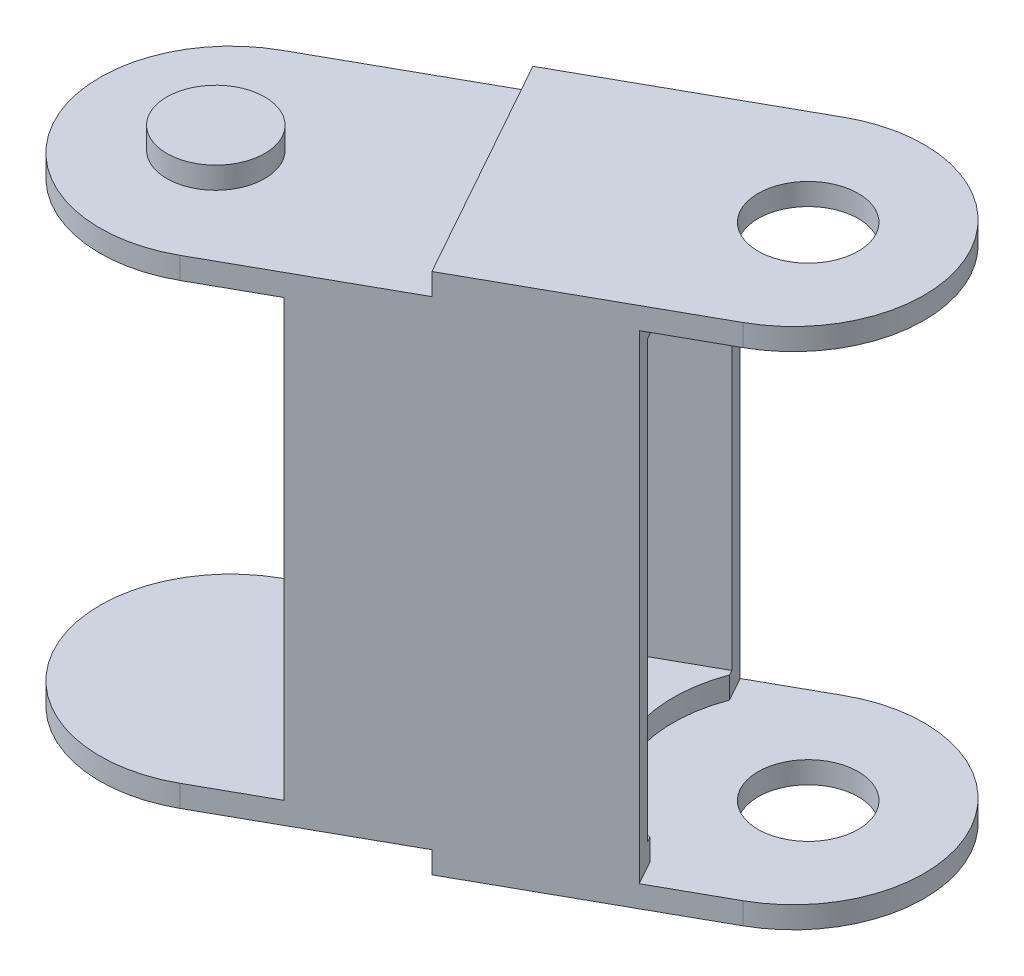
ISO-10303-21;
HEADER;
FILE_DESCRIPTION(('STEP AP214'),'2;1');
FILE_NAME('part.step','',(''),(''),'','','');
FILE_SCHEMA(('AUTOMOTIVE_DESIGN { 1 0 10303 214 1 1 1 1 }'));
ENDSEC;
DATA;
#1=APPLICATION_CONTEXT('core data for automotive mechanical design processes');
#2=APPLICATION_PROTOCOL_DEFINITION('international standard','automotive_design',2000,#1);
#3=PRODUCT_CONTEXT('',#1,'mechanical');
#4=PRODUCT('Part','Part','',(#3));
#5=PRODUCT_RELATED_PRODUCT_CATEGORY('part','',(#4));
#6=PRODUCT_DEFINITION_FORMATION('','',#4);
#7=PRODUCT_DEFINITION_CONTEXT('part definition',#1,'design');
#8=PRODUCT_DEFINITION('design','',#6,#7);
#9=PRODUCT_DEFINITION_SHAPE('','',#8);
#10=(LENGTH_UNIT() NAMED_UNIT(*) SI_UNIT(.MILLI.,.METRE.));
#11=(NAMED_UNIT(*) PLANE_ANGLE_UNIT() SI_UNIT($,.RADIAN.));
#12=(NAMED_UNIT(*) SI_UNIT($,.STERADIAN.) SOLID_ANGLE_UNIT());
#13=UNCERTAINTY_MEASURE_WITH_UNIT(LENGTH_MEASURE(1.E-05),#10,'distance_accuracy_value','');
#14=(GEOMETRIC_REPRESENTATION_CONTEXT(3) GLOBAL_UNCERTAINTY_ASSIGNED_CONTEXT((#13)) GLOBAL_UNIT_ASSIGNED_CONTEXT((#10,
#11,#12)) REPRESENTATION_CONTEXT('',''));
#15=CARTESIAN_POINT('',(0.,0.,0.));
#16=DIRECTION('',(0.,0.,1.));
#17=DIRECTION('',(1.,0.,0.));
#18=AXIS2_PLACEMENT_3D('',#15,#16,#17);
#19=CARTESIAN_POINT('',(-557.4671148621,21.5,9.7416578874));
#20=DIRECTION('',(0.,1.,0.));
#21=DIRECTION('',(-0.873355743090078,0.,0.487082894394351));
#22=AXIS2_PLACEMENT_3D('',#19,#20,#21);
#23=CYLINDRICAL_SURFACE('',#22,2.25);
#24=CARTESIAN_POINT('',(-557.4671148621,21.,9.7416578874));
#25=DIRECTION('',(0.,1.,0.));
#26=DIRECTION('',(-0.873355743090083,0.,0.487082894394342));
#27=AXIS2_PLACEMENT_3D('',#24,#25,#26);
#28=CIRCLE('',#27,2.25);
#29=CARTESIAN_POINT('',(-559.432165284053,21.,10.8375943997873));
#30=VERTEX_POINT('',#29);
#31=EDGE_CURVE('E205',#30,#30,#28,.F.);
#32=ORIENTED_EDGE('',*,*,#31,.F.);
#33=EDGE_LOOP('',(#32));
#34=FACE_BOUND('',#33,.T.);
#35=CARTESIAN_POINT('',(-557.4671148621,22.,9.7416578874));
#36=DIRECTION('',(0.,-1.,0.));
#37=DIRECTION('',(0.873355743090046,0.,-0.487082894394407));
#38=AXIS2_PLACEMENT_3D('',#35,#36,#37);
#39=CIRCLE('',#38,2.25);
#40=CARTESIAN_POINT('',(-555.502064440147,22.,8.64572137501259));
#41=VERTEX_POINT('',#40);
#42=EDGE_CURVE('E202',#41,#41,#39,.F.);
#43=ORIENTED_EDGE('',*,*,#42,.F.);
#44=EDGE_LOOP('',(#43));
#45=FACE_BOUND('',#44,.T.);
#46=ADVANCED_FACE('F17',(#34,#45),#23,.T.);
#47=CARTESIAN_POINT('',(-546.684415807773,21.,10.59804629639));
#48=DIRECTION('',(0.,1.,0.));
#49=DIRECTION('',(-0.487082894394448,0.,-0.873355743090023));
#50=AXIS2_PLACEMENT_3D('',#47,#48,#49);
#51=PLANE('',#50);
#52=CARTESIAN_POINT('',(-557.030436990516,21.,9.498116440067));
#53=DIRECTION('',(0.,1.,0.));
#54=DIRECTION('',(-0.87335574308192,0.,0.487082894408978));
#55=AXIS2_PLACEMENT_3D('',#52,#53,#54);
#56=CIRCLE('',#55,6.);
#57=CARTESIAN_POINT('',(-554.107939624171,21.,14.738250898619));
#58=VERTEX_POINT('',#57);
#59=CARTESIAN_POINT('',(-559.952934356816,21.,4.257981981657));
#60=VERTEX_POINT('',#59);
#61=EDGE_CURVE('E189',#58,#60,#56,.F.);
#62=ORIENTED_EDGE('',*,*,#61,.F.);
#63=DIRECTION('',(0.87335574309743,0.,-0.487082894381168));
#64=VECTOR('',#63,1.);
#65=CARTESIAN_POINT('',(-554.10793962415,21.,14.738250898657));
#66=LINE('',#65,#64);
#67=CARTESIAN_POINT('',(-546.684415807773,21.,10.59804629639));
#68=VERTEX_POINT('',#67);
#69=EDGE_CURVE('E177',#68,#58,#66,.F.);
#70=ORIENTED_EDGE('',*,*,#69,.F.);
#71=DIRECTION('',(-0.487082894394415,0.,-0.873355743090042));
#72=VECTOR('',#71,1.);
#73=CARTESIAN_POINT('',(-546.684415807773,21.,10.59804629639));
#74=LINE('',#73,#72);
#75=CARTESIAN_POINT('',(-552.5294105404,21.,0.1177773795));
#76=VERTEX_POINT('',#75);
#77=EDGE_CURVE('E188',#76,#68,#74,.F.);
#78=ORIENTED_EDGE('',*,*,#77,.F.);
#79=DIRECTION('',(-0.873355743104037,0.,0.487082894369322));
#80=VECTOR('',#79,1.);
#81=CARTESIAN_POINT('',(-552.5294105404,21.,0.1177773795));
#82=LINE('',#81,#80);
#83=EDGE_CURVE('E201',#60,#76,#82,.F.);
#84=ORIENTED_EDGE('',*,*,#83,.F.);
#85=EDGE_LOOP('',(#62,#70,#78,#84));
#86=FACE_BOUND('',#85,.T.);
#87=ORIENTED_EDGE('',*,*,#31,.T.);
#88=EDGE_LOOP('',(#87));
#89=FACE_BOUND('',#88,.T.);
#90=ADVANCED_FACE('F199',(#86,#89),#51,.T.);
#91=CARTESIAN_POINT('',(-556.627323554287,22.,6.628094558082));
#92=DIRECTION('',(0.,1.,0.));
#93=DIRECTION('',(-0.873355743090023,0.,0.487082894394448));
#94=AXIS2_PLACEMENT_3D('',#91,#92,#93);
#95=PLANE('',#94);
#96=ORIENTED_EDGE('',*,*,#42,.T.);
#97=EDGE_LOOP('',(#96));
#98=FACE_BOUND('',#97,.T.);
#99=ADVANCED_FACE('F629',(#98),#95,.T.);
#100=CARTESIAN_POINT('',(-557.030436990419,-2.,9.498116440241));
#101=DIRECTION('',(0.,1.,0.));
#102=DIRECTION('',(-0.487082894395104,0.,-0.873355743089657));
#103=AXIS2_PLACEMENT_3D('',#100,#101,#102);
#104=CYLINDRICAL_SURFACE('',#103,6.);
#105=DIRECTION('',(-1.7963E-11,-1.,1.0036E-11));
#106=VECTOR('',#105,1.);
#107=CARTESIAN_POINT('',(-559.95293435679,21.,4.257981981703));
#108=LINE('',#107,#106);
#109=CARTESIAN_POINT('',(-559.952934356808,20.,4.257981981713));
#110=VERTEX_POINT('',#109);
#111=EDGE_CURVE('E217',#110,#60,#108,.F.);
#112=ORIENTED_EDGE('',*,*,#111,.F.);
#113=CARTESIAN_POINT('',(-557.030436990419,20.,9.498116440241));
#114=DIRECTION('',(0.,1.,0.));
#115=DIRECTION('',(-0.4870828943981,0.,-0.873355743087987));
#116=AXIS2_PLACEMENT_3D('',#113,#114,#115);
#117=CIRCLE('',#116,6.);
#118=CARTESIAN_POINT('',(-554.107939624157,20.,14.738250898611));
#119=VERTEX_POINT('',#118);
#120=EDGE_CURVE('E196',#110,#119,#117,.T.);
#121=ORIENTED_EDGE('',*,*,#120,.T.);
#122=DIRECTION('',(-1.3983E-11,1.,7.791E-12));
#123=VECTOR('',#122,1.);
#124=CARTESIAN_POINT('',(-554.107939624157,20.,14.738250898611));
#125=LINE('',#124,#123);
#126=EDGE_CURVE('E181',#119,#58,#125,.T.);
#127=ORIENTED_EDGE('',*,*,#126,.T.);
#128=ORIENTED_EDGE('',*,*,#61,.T.);
#129=EDGE_LOOP('',(#112,#121,#127,#128));
#130=FACE_BOUND('',#129,.T.);
#131=ADVANCED_FACE('F195',(#130),#104,.T.);
#132=CARTESIAN_POINT('',(-554.107939624188,-2.,14.738250898743));
#133=DIRECTION('',(0.487082894394448,0.,0.873355743090023));
#134=DIRECTION('',(0.873355743090023,0.,-0.487082894394448));
#135=AXIS2_PLACEMENT_3D('',#132,#133,#134);
#136=PLANE('',#135);
#137=DIRECTION('',(-2.27E-13,-1.,1.3E-13));
#138=VECTOR('',#137,1.);
#139=CARTESIAN_POINT('',(-546.684415807808,22.,10.598046296326));
#140=LINE('',#139,#138);
#141=CARTESIAN_POINT('',(-546.684415807808,22.,10.598046296326));
#142=VERTEX_POINT('',#141);
#143=EDGE_CURVE('E184',#142,#68,#140,.T.);
#144=ORIENTED_EDGE('',*,*,#143,.T.);
#145=ORIENTED_EDGE('',*,*,#69,.T.);
#146=ORIENTED_EDGE('',*,*,#126,.F.);
#147=DIRECTION('',(0.87335574309002,0.,-0.487082894394455));
#148=VECTOR('',#147,1.);
#149=CARTESIAN_POINT('',(-554.107939624109,20.,14.738250898699));
#150=LINE('',#149,#148);
#151=CARTESIAN_POINT('',(-551.051194523223,20.,13.033460768279));
#152=VERTEX_POINT('',#151);
#153=EDGE_CURVE('E229',#119,#152,#150,.T.);
#154=ORIENTED_EDGE('',*,*,#153,.T.);
#155=DIRECTION('',(0.,-1.,0.));
#156=VECTOR('',#155,1.);
#157=CARTESIAN_POINT('',(-551.051194523223,20.,13.033460768279));
#158=LINE('',#157,#156);
#159=CARTESIAN_POINT('',(-551.051194523224,0.,13.033460768279));
#160=VERTEX_POINT('',#159);
#161=EDGE_CURVE('E233',#152,#160,#158,.T.);
#162=ORIENTED_EDGE('',*,*,#161,.T.);
#163=DIRECTION('',(-0.873355743090025,0.,0.487082894394445));
#164=VECTOR('',#163,1.);
#165=CARTESIAN_POINT('',(-551.051194523224,0.,13.033460768279));
#166=LINE('',#165,#164);
#167=CARTESIAN_POINT('',(-554.107939624123,0.,14.738250898706));
#168=VERTEX_POINT('',#167);
#169=EDGE_CURVE('E238',#160,#168,#166,.T.);
#170=ORIENTED_EDGE('',*,*,#169,.T.);
#171=DIRECTION('',(-3.865E-12,-1.,2.171E-12));
#172=VECTOR('',#171,1.);
#173=CARTESIAN_POINT('',(-554.107939624123,0.,14.738250898706));
#174=LINE('',#173,#172);
#175=CARTESIAN_POINT('',(-554.107939624126,-1.,14.738250898709));
#176=VERTEX_POINT('',#175);
#177=EDGE_CURVE('E243',#176,#168,#174,.F.);
#178=ORIENTED_EDGE('',*,*,#177,.F.);
#179=DIRECTION('',(0.873355743090023,0.,-0.487082894394448));
#180=VECTOR('',#179,1.);
#181=CARTESIAN_POINT('',(-554.107939624126,-1.,14.738250898709));
#182=LINE('',#181,#180);
#183=CARTESIAN_POINT('',(-546.684415807808,-1.,10.598046296326));
#184=VERTEX_POINT('',#183);
#185=EDGE_CURVE('E247',#176,#184,#182,.T.);
#186=ORIENTED_EDGE('',*,*,#185,.T.);
#187=DIRECTION('',(0.,-1.,0.));
#188=VECTOR('',#187,1.);
#189=CARTESIAN_POINT('',(-546.684415807808,-1.,10.598046296326));
#190=LINE('',#189,#188);
#191=CARTESIAN_POINT('',(-546.684415807808,-2.,10.598046296326));
#192=VERTEX_POINT('',#191);
#193=EDGE_CURVE('E252',#184,#192,#190,.T.);
#194=ORIENTED_EDGE('',*,*,#193,.T.);
#195=DIRECTION('',(0.873355743090022,0.,-0.48708289439445));
#196=VECTOR('',#195,1.);
#197=CARTESIAN_POINT('',(-546.684415807808,-2.,10.598046296326));
#198=LINE('',#197,#196);
#199=CARTESIAN_POINT('',(-537.514180505478,-2.,5.483675905249));
#200=VERTEX_POINT('',#199);
#201=EDGE_CURVE('E257',#192,#200,#198,.T.);
#202=ORIENTED_EDGE('',*,*,#201,.T.);
#203=DIRECTION('',(1.14E-13,1.,0.));
#204=VECTOR('',#203,1.);
#205=CARTESIAN_POINT('',(-537.514180505478,-2.,5.483675905249));
#206=LINE('',#205,#204);
#207=CARTESIAN_POINT('',(-537.514180505478,-1.,5.483675905249));
#208=VERTEX_POINT('',#207);
#209=EDGE_CURVE('E262',#200,#208,#206,.T.);
#210=ORIENTED_EDGE('',*,*,#209,.T.);
#211=DIRECTION('',(-0.87335574309003,0.,0.487082894394437));
#212=VECTOR('',#211,1.);
#213=CARTESIAN_POINT('',(-537.514180505478,-1.,5.483675905249));
#214=LINE('',#213,#212);
#215=CARTESIAN_POINT('',(-540.570925606115,-1.,7.18846603553));
#216=VERTEX_POINT('',#215);
#217=EDGE_CURVE('E267',#208,#216,#214,.T.);
#218=ORIENTED_EDGE('',*,*,#217,.T.);
#219=DIRECTION('',(0.,1.,0.));
#220=VECTOR('',#219,1.);
#221=CARTESIAN_POINT('',(-540.570925606115,-1.,7.18846603553));
#222=LINE('',#221,#220);
#223=CARTESIAN_POINT('',(-540.570925606115,21.,7.18846603553));
#224=VERTEX_POINT('',#223);
#225=EDGE_CURVE('E272',#216,#224,#222,.T.);
#226=ORIENTED_EDGE('',*,*,#225,.T.);
#227=DIRECTION('',(0.873355743090028,0.,-0.48708289439444));
#228=VECTOR('',#227,1.);
#229=CARTESIAN_POINT('',(-540.570925606115,21.,7.18846603553));
#230=LINE('',#229,#228);
#231=CARTESIAN_POINT('',(-537.514180505478,21.,5.483675905249));
#232=VERTEX_POINT('',#231);
#233=EDGE_CURVE('E277',#224,#232,#230,.T.);
#234=ORIENTED_EDGE('',*,*,#233,.T.);
#235=DIRECTION('',(0.,1.,0.));
#236=VECTOR('',#235,1.);
#237=CARTESIAN_POINT('',(-537.514180505478,21.,5.483675905249));
#238=LINE('',#237,#236);
#239=CARTESIAN_POINT('',(-537.514180505478,22.,5.483675905249));
#240=VERTEX_POINT('',#239);
#241=EDGE_CURVE('E282',#232,#240,#238,.T.);
#242=ORIENTED_EDGE('',*,*,#241,.T.);
#243=DIRECTION('',(-0.873355743090023,0.,0.487082894394449));
#244=VECTOR('',#243,1.);
#245=CARTESIAN_POINT('',(-537.514180505478,22.,5.483675905249));
#246=LINE('',#245,#244);
#247=EDGE_CURVE('E287',#240,#142,#246,.T.);
#248=ORIENTED_EDGE('',*,*,#247,.T.);
#249=EDGE_LOOP('',(#144,#145,#146,#154,#162,#170,#178,#186,#194,#202,#210,#218,#226,#234,#242,#248));
#250=FACE_BOUND('',#249,.T.);
#251=ADVANCED_FACE('F179',(#250),#136,.T.);
#252=CARTESIAN_POINT('',(-552.529410540427,21.,0.11777737945));
#253=DIRECTION('',(-0.873355743090023,0.,0.487082894394448));
#254=DIRECTION('',(0.487082894394448,0.,0.873355743090023));
#255=AXIS2_PLACEMENT_3D('',#252,#253,#254);
#256=PLANE('',#255);
#257=DIRECTION('',(-0.487082894394451,0.,-0.873355743090022));
#258=VECTOR('',#257,1.);
#259=CARTESIAN_POINT('',(-546.684415807773,22.,10.59804629639));
#260=LINE('',#259,#258);
#261=CARTESIAN_POINT('',(-552.529410540427,22.,0.11777737945));
#262=VERTEX_POINT('',#261);
#263=EDGE_CURVE('E291',#262,#142,#260,.F.);
#264=ORIENTED_EDGE('',*,*,#263,.F.);
#265=DIRECTION('',(2.7512E-11,-1.,4.9381E-11));
#266=VECTOR('',#265,1.);
#267=CARTESIAN_POINT('',(-552.529410540427,22.,0.11777737945));
#268=LINE('',#267,#266);
#269=EDGE_CURVE('E295',#76,#262,#268,.F.);
#270=ORIENTED_EDGE('',*,*,#269,.F.);
#271=ORIENTED_EDGE('',*,*,#77,.T.);
#272=ORIENTED_EDGE('',*,*,#143,.F.);
#273=EDGE_LOOP('',(#264,#270,#271,#272));
#274=FACE_BOUND('',#273,.T.);
#275=ADVANCED_FACE('F613',(#274),#256,.T.);
#276=CARTESIAN_POINT('',(-543.359175238211,-2.,-4.996593011832));
#277=DIRECTION('',(-0.487082894394448,0.,-0.873355743090023));
#278=DIRECTION('',(-0.873355743090023,0.,0.487082894394448));
#279=AXIS2_PLACEMENT_3D('',#276,#277,#278);
#280=PLANE('',#279);
#281=ORIENTED_EDGE('',*,*,#83,.T.);
#282=ORIENTED_EDGE('',*,*,#269,.T.);
#283=DIRECTION('',(0.873355743090023,0.,-0.487082894394448));
#284=VECTOR('',#283,1.);
#285=CARTESIAN_POINT('',(-552.529410540542,22.,0.117777379246));
#286=LINE('',#285,#284);
#287=CARTESIAN_POINT('',(-543.359175238211,22.,-4.996593011832));
#288=VERTEX_POINT('',#287);
#289=EDGE_CURVE('E300',#262,#288,#286,.T.);
#290=ORIENTED_EDGE('',*,*,#289,.T.);
#291=DIRECTION('',(0.,-1.,0.));
#292=VECTOR('',#291,1.);
#293=CARTESIAN_POINT('',(-543.359175238211,22.,-4.996593011832));
#294=LINE('',#293,#292);
#295=CARTESIAN_POINT('',(-543.359175238211,21.,-4.996593011832));
#296=VERTEX_POINT('',#295);
#297=EDGE_CURVE('E305',#296,#288,#294,.F.);
#298=ORIENTED_EDGE('',*,*,#297,.F.);
#299=DIRECTION('',(-0.873355743090024,0.,0.487082894394447));
#300=VECTOR('',#299,1.);
#301=CARTESIAN_POINT('',(-543.359175238211,21.,-4.996593011832));
#302=LINE('',#301,#300);
#303=CARTESIAN_POINT('',(-546.415920338848,21.,-3.291802881551));
#304=VERTEX_POINT('',#303);
#305=EDGE_CURVE('E310',#296,#304,#302,.T.);
#306=ORIENTED_EDGE('',*,*,#305,.T.);
#307=DIRECTION('',(0.,-1.,0.));
#308=VECTOR('',#307,1.);
#309=CARTESIAN_POINT('',(-546.415920338848,21.,-3.291802881551));
#310=LINE('',#309,#308);
#311=CARTESIAN_POINT('',(-546.415920338848,-1.,-3.29180288155));
#312=VERTEX_POINT('',#311);
#313=EDGE_CURVE('E315',#304,#312,#310,.T.);
#314=ORIENTED_EDGE('',*,*,#313,.T.);
#315=DIRECTION('',(0.873355743090022,0.,-0.487082894394451));
#316=VECTOR('',#315,1.);
#317=CARTESIAN_POINT('',(-546.415920338848,-1.,-3.29180288155));
#318=LINE('',#317,#316);
#319=CARTESIAN_POINT('',(-543.359175238211,-1.,-4.996593011832));
#320=VERTEX_POINT('',#319);
#321=EDGE_CURVE('E320',#312,#320,#318,.T.);
#322=ORIENTED_EDGE('',*,*,#321,.T.);
#323=DIRECTION('',(0.,-1.,0.));
#324=VECTOR('',#323,1.);
#325=CARTESIAN_POINT('',(-543.359175238211,-1.,-4.996593011832));
#326=LINE('',#325,#324);
#327=CARTESIAN_POINT('',(-543.359175238211,-2.,-4.996593011832));
#328=VERTEX_POINT('',#327);
#329=EDGE_CURVE('E325',#328,#320,#326,.F.);
#330=ORIENTED_EDGE('',*,*,#329,.F.);
#331=DIRECTION('',(-0.873355743090022,0.,0.487082894394451));
#332=VECTOR('',#331,1.);
#333=CARTESIAN_POINT('',(-543.359175238211,-2.,-4.996593011832));
#334=LINE('',#333,#332);
#335=CARTESIAN_POINT('',(-552.529410540542,-2.,0.117777379246));
#336=VERTEX_POINT('',#335);
#337=EDGE_CURVE('E330',#328,#336,#334,.T.);
#338=ORIENTED_EDGE('',*,*,#337,.T.);
#339=DIRECTION('',(0.,1.,0.));
#340=VECTOR('',#339,1.);
#341=CARTESIAN_POINT('',(-552.529410540542,-2.,0.117777379246));
#342=LINE('',#341,#340);
#343=CARTESIAN_POINT('',(-552.529410540542,-1.,0.117777379246));
#344=VERTEX_POINT('',#343);
#345=EDGE_CURVE('E335',#336,#344,#342,.T.);
#346=ORIENTED_EDGE('',*,*,#345,.T.);
#347=DIRECTION('',(-0.873355743090025,0.,0.487082894394445));
#348=VECTOR('',#347,1.);
#349=CARTESIAN_POINT('',(-552.529410540542,-1.,0.117777379246));
#350=LINE('',#349,#348);
#351=CARTESIAN_POINT('',(-559.952934356838,-1.,4.257981981616));
#352=VERTEX_POINT('',#351);
#353=EDGE_CURVE('E340',#344,#352,#350,.T.);
#354=ORIENTED_EDGE('',*,*,#353,.T.);
#355=DIRECTION('',(-4.093E-12,1.,2.288E-12));
#356=VECTOR('',#355,1.);
#357=CARTESIAN_POINT('',(-559.952934356838,-1.,4.257981981616));
#358=LINE('',#357,#356);
#359=CARTESIAN_POINT('',(-559.952934356842,0.,4.257981981619));
#360=VERTEX_POINT('',#359);
#361=EDGE_CURVE('E345',#352,#360,#358,.T.);
#362=ORIENTED_EDGE('',*,*,#361,.T.);
#363=DIRECTION('',(0.87335574309002,0.,-0.487082894394454));
#364=VECTOR('',#363,1.);
#365=CARTESIAN_POINT('',(-559.952934356842,0.,4.257981981619));
#366=LINE('',#365,#364);
#367=CARTESIAN_POINT('',(-556.896189255956,0.,2.553191851199));
#368=VERTEX_POINT('',#367);
#369=EDGE_CURVE('E350',#360,#368,#366,.T.);
#370=ORIENTED_EDGE('',*,*,#369,.T.);
#371=DIRECTION('',(0.,1.,0.));
#372=VECTOR('',#371,1.);
#373=CARTESIAN_POINT('',(-556.896189255956,0.,2.553191851199));
#374=LINE('',#373,#372);
#375=CARTESIAN_POINT('',(-556.896189255956,20.,2.553191851199));
#376=VERTEX_POINT('',#375);
#377=EDGE_CURVE('E355',#368,#376,#374,.T.);
#378=ORIENTED_EDGE('',*,*,#377,.T.);
#379=DIRECTION('',(-0.87335574309002,0.,0.487082894394454));
#380=VECTOR('',#379,1.);
#381=CARTESIAN_POINT('',(-556.896189255956,20.,2.553191851199));
#382=LINE('',#381,#380);
#383=EDGE_CURVE('E360',#376,#110,#382,.T.);
#384=ORIENTED_EDGE('',*,*,#383,.T.);
#385=ORIENTED_EDGE('',*,*,#111,.T.);
#386=EDGE_LOOP('',(#281,#282,#290,#298,#306,#314,#322,#330,#338,#346,#354,#362,#370,#378,#384,#385));
#387=FACE_BOUND('',#386,.T.);
#388=ADVANCED_FACE('F555',(#387),#280,.T.);
#389=CARTESIAN_POINT('',(-546.415920338848,20.,-3.291802881551));
#390=DIRECTION('',(0.,-1.,0.));
#391=DIRECTION('',(0.487082894394448,0.,0.873355743090023));
#392=AXIS2_PLACEMENT_3D('',#389,#390,#391);
#393=PLANE('',#392);
#394=CARTESIAN_POINT('',(-540.000000000299,20.,-4.89E-10));
#395=DIRECTION('',(0.,1.,0.));
#396=DIRECTION('',(-0.873355743090052,0.,0.487082894394396));
#397=AXIS2_PLACEMENT_3D('',#394,#395,#396);
#398=CIRCLE('',#397,6.2);
#399=CARTESIAN_POINT('',(-545.80077736678,20.,-2.18883118277));
#400=VERTEX_POINT('',#399);
#401=CARTESIAN_POINT('',(-541.186068578183,20.,6.085494336749));
#402=VERTEX_POINT('',#401);
#403=EDGE_CURVE('E365',#400,#402,#398,.T.);
#404=ORIENTED_EDGE('',*,*,#403,.T.);
#405=DIRECTION('',(0.487082894394611,0.,0.873355743089933));
#406=VECTOR('',#405,1.);
#407=CARTESIAN_POINT('',(-541.186068578183,20.,6.085494336749));
#408=LINE('',#407,#406);
#409=CARTESIAN_POINT('',(-541.058008500509,20.,6.315110292439));
#410=VERTEX_POINT('',#409);
#411=EDGE_CURVE('E370',#402,#410,#408,.T.);
#412=ORIENTED_EDGE('',*,*,#411,.T.);
#413=DIRECTION('',(-0.873355743090029,0.,0.487082894394438));
#414=VECTOR('',#413,1.);
#415=CARTESIAN_POINT('',(-541.058008500509,20.,6.315110292439));
#416=LINE('',#415,#414);
#417=CARTESIAN_POINT('',(-551.538277417618,20.,12.160105025189));
#418=VERTEX_POINT('',#417);
#419=EDGE_CURVE('E375',#418,#410,#416,.F.);
#420=ORIENTED_EDGE('',*,*,#419,.F.);
#421=DIRECTION('',(0.487082894394814,0.,0.873355743089819));
#422=VECTOR('',#421,1.);
#423=CARTESIAN_POINT('',(-551.538277417618,20.,12.160105025189));
#424=LINE('',#423,#422);
#425=EDGE_CURVE('E379',#152,#418,#424,.F.);
#426=ORIENTED_EDGE('',*,*,#425,.F.);
#427=ORIENTED_EDGE('',*,*,#153,.F.);
#428=ORIENTED_EDGE('',*,*,#120,.F.);
#429=ORIENTED_EDGE('',*,*,#383,.F.);
#430=DIRECTION('',(0.487082894394524,0.,0.873355743089981));
#431=VECTOR('',#430,1.);
#432=CARTESIAN_POINT('',(-556.896189255952,20.,2.553191851207));
#433=LINE('',#432,#431);
#434=CARTESIAN_POINT('',(-556.409106361562,20.,3.426547594288));
#435=VERTEX_POINT('',#434);
#436=EDGE_CURVE('E384',#435,#376,#433,.F.);
#437=ORIENTED_EDGE('',*,*,#436,.F.);
#438=DIRECTION('',(0.87335574309002,0.,-0.487082894394454));
#439=VECTOR('',#438,1.);
#440=CARTESIAN_POINT('',(-556.409106361562,20.,3.426547594288));
#441=LINE('',#440,#439);
#442=CARTESIAN_POINT('',(-545.928837444454,20.,-2.418447138461));
#443=VERTEX_POINT('',#442);
#444=EDGE_CURVE('E388',#443,#435,#441,.F.);
#445=ORIENTED_EDGE('',*,*,#444,.F.);
#446=DIRECTION('',(0.487082894395284,0.,0.873355743089557));
#447=VECTOR('',#446,1.);
#448=CARTESIAN_POINT('',(-545.928837444454,20.,-2.418447138461));
#449=LINE('',#448,#447);
#450=EDGE_CURVE('E392',#443,#400,#449,.T.);
#451=ORIENTED_EDGE('',*,*,#450,.T.);
#452=EDGE_LOOP('',(#404,#412,#420,#426,#427,#428,#429,#437,#445,#451));
#453=FACE_BOUND('',#452,.T.);
#454=ADVANCED_FACE('F557',(#453),#393,.T.);
#455=CARTESIAN_POINT('',(-551.538277417618,20.,12.160105025188));
#456=DIRECTION('',(-0.873355743090024,0.,0.487082894394448));
#457=DIRECTION('',(0.,-1.,0.));
#458=AXIS2_PLACEMENT_3D('',#455,#456,#457);
#459=PLANE('',#458);
#460=DIRECTION('',(0.,-1.,0.));
#461=VECTOR('',#460,1.);
#462=CARTESIAN_POINT('',(-551.538277417618,20.,12.160105025188));
#463=LINE('',#462,#461);
#464=CARTESIAN_POINT('',(-551.538277417618,0.,12.160105025188));
#465=VERTEX_POINT('',#464);
#466=EDGE_CURVE('E397',#465,#418,#463,.F.);
#467=ORIENTED_EDGE('',*,*,#466,.F.);
#468=DIRECTION('',(0.487082894394448,0.,0.873355743090023));
#469=VECTOR('',#468,1.);
#470=CARTESIAN_POINT('',(-551.538277417618,0.,12.160105025188));
#471=LINE('',#470,#469);
#472=EDGE_CURVE('E401',#465,#160,#471,.T.);
#473=ORIENTED_EDGE('',*,*,#472,.T.);
#474=ORIENTED_EDGE('',*,*,#161,.F.);
#475=ORIENTED_EDGE('',*,*,#425,.T.);
#476=EDGE_LOOP('',(#467,#473,#474,#475));
#477=FACE_BOUND('',#476,.T.);
#478=ADVANCED_FACE('F563',(#477),#459,.T.);
#479=CARTESIAN_POINT('',(-546.415920338848,0.,-3.291802881551));
#480=DIRECTION('',(0.,1.,0.));
#481=DIRECTION('',(-0.873355743090023,0.,0.487082894394448));
#482=AXIS2_PLACEMENT_3D('',#479,#480,#481);
#483=PLANE('',#482);
#484=CARTESIAN_POINT('',(-540.000000000299,0.,-4.89E-10));
#485=DIRECTION('',(0.,-1.,0.));
#486=DIRECTION('',(-0.873355743090052,0.,0.487082894394396));
#487=AXIS2_PLACEMENT_3D('',#484,#485,#486);
#488=CIRCLE('',#487,6.2);
#489=CARTESIAN_POINT('',(-541.186068578183,0.,6.085494336749));
#490=VERTEX_POINT('',#489);
#491=CARTESIAN_POINT('',(-545.80077736678,0.,-2.18883118277));
#492=VERTEX_POINT('',#491);
#493=EDGE_CURVE('E406',#490,#492,#488,.T.);
#494=ORIENTED_EDGE('',*,*,#493,.T.);
#495=DIRECTION('',(-0.487082894395009,0.,-0.873355743089711));
#496=VECTOR('',#495,1.);
#497=CARTESIAN_POINT('',(-545.80077736678,0.,-2.18883118277));
#498=LINE('',#497,#496);
#499=CARTESIAN_POINT('',(-545.928837444454,0.,-2.418447138461));
#500=VERTEX_POINT('',#499);
#501=EDGE_CURVE('E411',#492,#500,#498,.T.);
#502=ORIENTED_EDGE('',*,*,#501,.T.);
#503=DIRECTION('',(-0.873355743090019,0.,0.487082894394455));
#504=VECTOR('',#503,1.);
#505=CARTESIAN_POINT('',(-545.928837444454,0.,-2.418447138461));
#506=LINE('',#505,#504);
#507=CARTESIAN_POINT('',(-556.409106361562,0.,3.426547594288));
#508=VERTEX_POINT('',#507);
#509=EDGE_CURVE('E416',#508,#500,#506,.F.);
#510=ORIENTED_EDGE('',*,*,#509,.F.);
#511=DIRECTION('',(-0.487082894394477,0.,-0.873355743090007));
#512=VECTOR('',#511,1.);
#513=CARTESIAN_POINT('',(-556.409106361562,0.,3.426547594288));
#514=LINE('',#513,#512);
#515=EDGE_CURVE('E420',#368,#508,#514,.F.);
#516=ORIENTED_EDGE('',*,*,#515,.F.);
#517=ORIENTED_EDGE('',*,*,#369,.F.);
#518=CARTESIAN_POINT('',(-557.030436990516,0.,9.498116440067));
#519=DIRECTION('',(0.,1.,0.));
#520=DIRECTION('',(-0.873355743081919,0.,0.487082894408979));
#521=AXIS2_PLACEMENT_3D('',#518,#519,#520);
#522=CIRCLE('',#521,6.);
#523=EDGE_CURVE('E425',#168,#360,#522,.F.);
#524=ORIENTED_EDGE('',*,*,#523,.F.);
#525=ORIENTED_EDGE('',*,*,#169,.F.);
#526=ORIENTED_EDGE('',*,*,#472,.F.);
#527=DIRECTION('',(0.873355743090031,0.,-0.487082894394435));
#528=VECTOR('',#527,1.);
#529=CARTESIAN_POINT('',(-551.538277417618,0.,12.160105025188));
#530=LINE('',#529,#528);
#531=CARTESIAN_POINT('',(-541.058008500509,0.,6.315110292439));
#532=VERTEX_POINT('',#531);
#533=EDGE_CURVE('E429',#532,#465,#530,.F.);
#534=ORIENTED_EDGE('',*,*,#533,.F.);
#535=DIRECTION('',(-0.487082894395615,0.,-0.873355743089373));
#536=VECTOR('',#535,1.);
#537=CARTESIAN_POINT('',(-541.058008500509,0.,6.315110292439));
#538=LINE('',#537,#536);
#539=EDGE_CURVE('E433',#532,#490,#538,.T.);
#540=ORIENTED_EDGE('',*,*,#539,.T.);
#541=EDGE_LOOP('',(#494,#502,#510,#516,#517,#524,#525,#526,#534,#540));
#542=FACE_BOUND('',#541,.T.);
#543=ADVANCED_FACE('F549',(#542),#483,.T.);
#544=CARTESIAN_POINT('',(-557.030436990516,-2.,9.498116440067));
#545=DIRECTION('',(0.,1.,0.));
#546=DIRECTION('',(-0.873355743081922,0.,0.487082894408974));
#547=AXIS2_PLACEMENT_3D('',#544,#545,#546);
#548=CYLINDRICAL_SURFACE('',#547,6.);
#549=ORIENTED_EDGE('',*,*,#177,.T.);
#550=ORIENTED_EDGE('',*,*,#523,.T.);
#551=ORIENTED_EDGE('',*,*,#361,.F.);
#552=CARTESIAN_POINT('',(-557.030436990419,-1.,9.498116440241));
#553=DIRECTION('',(0.,-1.,0.));
#554=DIRECTION('',(-0.873355743098144,0.,0.487082894379888));
#555=AXIS2_PLACEMENT_3D('',#552,#553,#554);
#556=CIRCLE('',#555,6.);
#557=EDGE_CURVE('E438',#352,#176,#556,.F.);
#558=ORIENTED_EDGE('',*,*,#557,.T.);
#559=EDGE_LOOP('',(#549,#550,#551,#558));
#560=FACE_BOUND('',#559,.T.);
#561=ADVANCED_FACE('F570',(#560),#548,.T.);
#562=CARTESIAN_POINT('',(-552.529410540519,-1.,0.117777379286));
#563=DIRECTION('',(0.,-1.,0.));
#564=DIRECTION('',(0.487082894394448,0.,0.873355743090023));
#565=AXIS2_PLACEMENT_3D('',#562,#563,#564);
#566=PLANE('',#565);
#567=ORIENTED_EDGE('',*,*,#557,.F.);
#568=ORIENTED_EDGE('',*,*,#353,.F.);
#569=DIRECTION('',(0.487082894394444,0.,0.873355743090026));
#570=VECTOR('',#569,1.);
#571=CARTESIAN_POINT('',(-552.529410540506,-1.,0.117777379309));
#572=LINE('',#571,#570);
#573=EDGE_CURVE('E443',#344,#184,#572,.T.);
#574=ORIENTED_EDGE('',*,*,#573,.T.);
#575=ORIENTED_EDGE('',*,*,#185,.F.);
#576=EDGE_LOOP('',(#567,#568,#574,#575));
#577=FACE_BOUND('',#576,.T.);
#578=CARTESIAN_POINT('',(-557.4671148621,-1.,9.7416578874));
#579=DIRECTION('',(0.,1.,0.));
#580=DIRECTION('',(-0.873355743090078,0.,0.48708289439435));
#581=AXIS2_PLACEMENT_3D('',#578,#579,#580);
#582=CIRCLE('',#581,2.25);
#583=CARTESIAN_POINT('',(-559.432165284053,-1.,10.8375943997873));
#584=VERTEX_POINT('',#583);
#585=EDGE_CURVE('E448',#584,#584,#582,.T.);
#586=ORIENTED_EDGE('',*,*,#585,.T.);
#587=EDGE_LOOP('',(#586));
#588=FACE_BOUND('',#587,.T.);
#589=ADVANCED_FACE('F574',(#577,#588),#566,.T.);
#590=CARTESIAN_POINT('',(-552.529410540506,-2.,0.117777379309));
#591=DIRECTION('',(-0.873355743090023,0.,0.487082894394448));
#592=DIRECTION('',(0.487082894394448,0.,0.873355743090023));
#593=AXIS2_PLACEMENT_3D('',#590,#591,#592);
#594=PLANE('',#593);
#595=ORIENTED_EDGE('',*,*,#573,.F.);
#596=ORIENTED_EDGE('',*,*,#345,.F.);
#597=DIRECTION('',(0.487082894394448,0.,0.873355743090023));
#598=VECTOR('',#597,1.);
#599=CARTESIAN_POINT('',(-552.529410540506,-2.,0.117777379309));
#600=LINE('',#599,#598);
#601=EDGE_CURVE('E453',#192,#336,#600,.F.);
#602=ORIENTED_EDGE('',*,*,#601,.F.);
#603=ORIENTED_EDGE('',*,*,#193,.F.);
#604=EDGE_LOOP('',(#595,#596,#602,#603));
#605=FACE_BOUND('',#604,.T.);
#606=ADVANCED_FACE('F578',(#605),#594,.T.);
#607=CARTESIAN_POINT('',(-538.119040779758,-2.,-7.91909037815));
#608=DIRECTION('',(0.,-1.,0.));
#609=DIRECTION('',(0.487082894394448,0.,0.873355743090023));
#610=AXIS2_PLACEMENT_3D('',#607,#608,#609);
#611=PLANE('',#610);
#612=ORIENTED_EDGE('',*,*,#601,.T.);
#613=ORIENTED_EDGE('',*,*,#337,.F.);
#614=CARTESIAN_POINT('',(-540.436677871981,-2.,0.24354144667));
#615=DIRECTION('',(0.,-1.,0.));
#616=DIRECTION('',(0.873355743098156,0.,-0.487082894379866));
#617=AXIS2_PLACEMENT_3D('',#614,#615,#616);
#618=CIRCLE('',#617,6.);
#619=EDGE_CURVE('E455',#200,#328,#618,.F.);
#620=ORIENTED_EDGE('',*,*,#619,.F.);
#621=ORIENTED_EDGE('',*,*,#201,.F.);
#622=EDGE_LOOP('',(#612,#613,#620,#621));
#623=FACE_BOUND('',#622,.T.);
#624=CARTESIAN_POINT('',(-540.,-2.,0.));
#625=DIRECTION('',(0.,1.,0.));
#626=DIRECTION('',(-0.873355743090022,0.,0.48708289439445));
#627=AXIS2_PLACEMENT_3D('',#624,#625,#626);
#628=CIRCLE('',#627,2.3);
#629=CARTESIAN_POINT('',(-542.008718209107,-2.,1.12029065710723));
#630=VERTEX_POINT('',#629);
#631=EDGE_CURVE('E459',#630,#630,#628,.T.);
#632=ORIENTED_EDGE('',*,*,#631,.T.);
#633=EDGE_LOOP('',(#632));
#634=FACE_BOUND('',#633,.T.);
#635=ADVANCED_FACE('F581',(#623,#634),#611,.T.);
#636=CARTESIAN_POINT('',(-540.436677871981,-2.,0.24354144667));
#637=DIRECTION('',(0.,1.,0.));
#638=DIRECTION('',(0.487082894409042,0.,0.873355743081884));
#639=AXIS2_PLACEMENT_3D('',#636,#637,#638);
#640=CYLINDRICAL_SURFACE('',#639,6.);
#641=ORIENTED_EDGE('',*,*,#209,.F.);
#642=ORIENTED_EDGE('',*,*,#619,.T.);
#643=ORIENTED_EDGE('',*,*,#329,.T.);
#644=CARTESIAN_POINT('',(-540.436677871883,-1.,0.243541446844));
#645=DIRECTION('',(0.,1.,0.));
#646=DIRECTION('',(0.873355743081897,0.,-0.48708289440902));
#647=AXIS2_PLACEMENT_3D('',#644,#645,#646);
#648=CIRCLE('',#647,6.);
#649=EDGE_CURVE('E464',#320,#208,#648,.F.);
#650=ORIENTED_EDGE('',*,*,#649,.T.);
#651=EDGE_LOOP('',(#641,#642,#643,#650));
#652=FACE_BOUND('',#651,.T.);
#653=ADVANCED_FACE('F587',(#652),#640,.T.);
#654=CARTESIAN_POINT('',(-538.119040779759,-1.,-7.91909037815));
#655=DIRECTION('',(0.,1.,0.));
#656=DIRECTION('',(-0.873355743090023,0.,0.487082894394448));
#657=AXIS2_PLACEMENT_3D('',#654,#655,#656);
#658=PLANE('',#657);
#659=ORIENTED_EDGE('',*,*,#217,.F.);
#660=ORIENTED_EDGE('',*,*,#649,.F.);
#661=ORIENTED_EDGE('',*,*,#321,.F.);
#662=DIRECTION('',(0.487082894394673,0.,0.873355743089898));
#663=VECTOR('',#662,1.);
#664=CARTESIAN_POINT('',(-546.415920338805,-1.,-3.291802881474));
#665=LINE('',#664,#663);
#666=CARTESIAN_POINT('',(-545.80077736678,-1.,-2.18883118277));
#667=VERTEX_POINT('',#666);
#668=EDGE_CURVE('E467',#667,#312,#665,.F.);
#669=ORIENTED_EDGE('',*,*,#668,.F.);
#670=CARTESIAN_POINT('',(-540.000000000299,-1.,-4.89E-10));
#671=DIRECTION('',(0.,1.,0.));
#672=DIRECTION('',(-0.873355743090052,0.,0.487082894394396));
#673=AXIS2_PLACEMENT_3D('',#670,#671,#672);
#674=CIRCLE('',#673,6.2);
#675=CARTESIAN_POINT('',(-541.186068578183,-1.,6.085494336749));
#676=VERTEX_POINT('',#675);
#677=EDGE_CURVE('E471',#676,#667,#674,.F.);
#678=ORIENTED_EDGE('',*,*,#677,.F.);
#679=DIRECTION('',(0.487082894394543,0.,0.873355743089971));
#680=VECTOR('',#679,1.);
#681=CARTESIAN_POINT('',(-541.186068578183,-1.,6.085494336749));
#682=LINE('',#681,#680);
#683=EDGE_CURVE('E475',#216,#676,#682,.F.);
#684=ORIENTED_EDGE('',*,*,#683,.F.);
#685=EDGE_LOOP('',(#659,#660,#661,#669,#678,#684));
#686=FACE_BOUND('',#685,.T.);
#687=CARTESIAN_POINT('',(-540.,-1.,0.));
#688=DIRECTION('',(0.,-1.,0.));
#689=DIRECTION('',(0.873355743090006,0.,-0.48708289439448));
#690=AXIS2_PLACEMENT_3D('',#687,#688,#689);
#691=CIRCLE('',#690,2.3);
#692=CARTESIAN_POINT('',(-537.991281790893,-1.,-1.1202906571073));
#693=VERTEX_POINT('',#692);
#694=EDGE_CURVE('E480',#693,#693,#691,.T.);
#695=ORIENTED_EDGE('',*,*,#694,.T.);
#696=EDGE_LOOP('',(#695));
#697=FACE_BOUND('',#696,.T.);
#698=ADVANCED_FACE('F590',(#686,#697),#658,.T.);
#699=CARTESIAN_POINT('',(-541.186068578183,-1.,6.085494336749));
#700=DIRECTION('',(0.873355743090023,0.,-0.487082894394448));
#701=DIRECTION('',(0.,1.,0.));
#702=AXIS2_PLACEMENT_3D('',#699,#700,#701);
#703=PLANE('',#702);
#704=DIRECTION('',(0.,1.,0.));
#705=VECTOR('',#704,1.);
#706=CARTESIAN_POINT('',(-541.186068578183,20.,6.085494336749));
#707=LINE('',#706,#705);
#708=CARTESIAN_POINT('',(-541.186068578183,21.,6.085494336749));
#709=VERTEX_POINT('',#708);
#710=EDGE_CURVE('E485',#402,#709,#707,.T.);
#711=ORIENTED_EDGE('',*,*,#710,.T.);
#712=DIRECTION('',(0.487082894394424,0.,0.873355743090037));
#713=VECTOR('',#712,1.);
#714=CARTESIAN_POINT('',(-541.186068578183,21.,6.085494336749));
#715=LINE('',#714,#713);
#716=EDGE_CURVE('E487',#709,#224,#715,.T.);
#717=ORIENTED_EDGE('',*,*,#716,.T.);
#718=ORIENTED_EDGE('',*,*,#225,.F.);
#719=ORIENTED_EDGE('',*,*,#683,.T.);
#720=DIRECTION('',(0.,1.,0.));
#721=VECTOR('',#720,1.);
#722=CARTESIAN_POINT('',(-541.186068578183,-1.,6.085494336749));
#723=LINE('',#722,#721);
#724=EDGE_CURVE('E492',#676,#490,#723,.T.);
#725=ORIENTED_EDGE('',*,*,#724,.T.);
#726=ORIENTED_EDGE('',*,*,#539,.F.);
#727=DIRECTION('',(0.,1.,0.));
#728=VECTOR('',#727,1.);
#729=CARTESIAN_POINT('',(-541.058008500509,0.,6.31511029244));
#730=LINE('',#729,#728);
#731=EDGE_CURVE('E497',#410,#532,#730,.F.);
#732=ORIENTED_EDGE('',*,*,#731,.F.);
#733=ORIENTED_EDGE('',*,*,#411,.F.);
#734=EDGE_LOOP('',(#711,#717,#718,#719,#725,#726,#732,#733));
#735=FACE_BOUND('',#734,.T.);
#736=ADVANCED_FACE('F595',(#735),#703,.T.);
#737=CARTESIAN_POINT('',(-538.119040779749,21.,-7.919090378134));
#738=DIRECTION('',(0.,-1.,0.));
#739=DIRECTION('',(0.487082894394448,0.,0.873355743090023));
#740=AXIS2_PLACEMENT_3D('',#737,#738,#739);
#741=PLANE('',#740);
#742=ORIENTED_EDGE('',*,*,#305,.F.);
#743=CARTESIAN_POINT('',(-540.436677871981,21.,0.24354144667));
#744=DIRECTION('',(0.,-1.,0.));
#745=DIRECTION('',(0.87335574309815,0.,-0.487082894379877));
#746=AXIS2_PLACEMENT_3D('',#743,#744,#745);
#747=CIRCLE('',#746,6.);
#748=EDGE_CURVE('E501',#232,#296,#747,.F.);
#749=ORIENTED_EDGE('',*,*,#748,.F.);
#750=ORIENTED_EDGE('',*,*,#233,.F.);
#751=ORIENTED_EDGE('',*,*,#716,.F.);
#752=CARTESIAN_POINT('',(-540.000000000299,21.,-4.89E-10));
#753=DIRECTION('',(0.,-1.,0.));
#754=DIRECTION('',(-0.873355743090052,0.,0.487082894394397));
#755=AXIS2_PLACEMENT_3D('',#752,#753,#754);
#756=CIRCLE('',#755,6.2);
#757=CARTESIAN_POINT('',(-545.80077736678,21.,-2.18883118277));
#758=VERTEX_POINT('',#757);
#759=EDGE_CURVE('E36',#758,#709,#756,.F.);
#760=ORIENTED_EDGE('',*,*,#759,.F.);
#761=DIRECTION('',(-0.487082894394559,0.,-0.873355743089962));
#762=VECTOR('',#761,1.);
#763=CARTESIAN_POINT('',(-545.80077736678,21.,-2.18883118277));
#764=LINE('',#763,#762);
#765=EDGE_CURVE('E508',#304,#758,#764,.F.);
#766=ORIENTED_EDGE('',*,*,#765,.F.);
#767=EDGE_LOOP('',(#742,#749,#750,#751,#760,#766));
#768=FACE_BOUND('',#767,.T.);
#769=CARTESIAN_POINT('',(-540.,21.,0.));
#770=DIRECTION('',(0.,1.,0.));
#771=DIRECTION('',(0.873355743090027,0.,-0.487082894394442));
#772=AXIS2_PLACEMENT_3D('',#769,#770,#771);
#773=CIRCLE('',#772,2.3);
#774=CARTESIAN_POINT('',(-537.991281790893,21.,-1.12029065710722));
#775=VERTEX_POINT('',#774);
#776=EDGE_CURVE('E513',#775,#775,#773,.T.);
#777=ORIENTED_EDGE('',*,*,#776,.T.);
#778=EDGE_LOOP('',(#777));
#779=FACE_BOUND('',#778,.T.);
#780=ADVANCED_FACE('F600',(#768,#779),#741,.T.);
#781=CARTESIAN_POINT('',(-540.436677871981,-2.,0.24354144667));
#782=DIRECTION('',(0.,1.,0.));
#783=DIRECTION('',(0.487082894409048,0.,0.873355743081881));
#784=AXIS2_PLACEMENT_3D('',#781,#782,#783);
#785=CYLINDRICAL_SURFACE('',#784,6.);
#786=ORIENTED_EDGE('',*,*,#748,.T.);
#787=ORIENTED_EDGE('',*,*,#297,.T.);
#788=CARTESIAN_POINT('',(-540.436677871883,22.,0.243541446844));
#789=DIRECTION('',(0.,1.,0.));
#790=DIRECTION('',(0.873355743081896,0.,-0.48708289440902));
#791=AXIS2_PLACEMENT_3D('',#788,#789,#790);
#792=CIRCLE('',#791,6.);
#793=EDGE_CURVE('E518',#288,#240,#792,.F.);
#794=ORIENTED_EDGE('',*,*,#793,.T.);
#795=ORIENTED_EDGE('',*,*,#241,.F.);
#796=EDGE_LOOP('',(#786,#787,#794,#795));
#797=FACE_BOUND('',#796,.T.);
#798=ADVANCED_FACE('F605',(#797),#785,.T.);
#799=CARTESIAN_POINT('',(-538.119040779758,22.,-7.91909037815));
#800=DIRECTION('',(0.,1.,0.));
#801=DIRECTION('',(-0.873355743090023,0.,0.487082894394448));
#802=AXIS2_PLACEMENT_3D('',#799,#800,#801);
#803=PLANE('',#802);
#804=ORIENTED_EDGE('',*,*,#263,.T.);
#805=ORIENTED_EDGE('',*,*,#247,.F.);
#806=ORIENTED_EDGE('',*,*,#793,.F.);
#807=ORIENTED_EDGE('',*,*,#289,.F.);
#808=EDGE_LOOP('',(#804,#805,#806,#807));
#809=FACE_BOUND('',#808,.T.);
#810=CARTESIAN_POINT('',(-540.,22.,0.));
#811=DIRECTION('',(0.,-1.,0.));
#812=DIRECTION('',(-0.873355743090001,0.,0.487082894394488));
#813=AXIS2_PLACEMENT_3D('',#810,#811,#812);
#814=CIRCLE('',#813,2.3);
#815=CARTESIAN_POINT('',(-542.008718209107,22.,1.12029065710732));
#816=VERTEX_POINT('',#815);
#817=EDGE_CURVE('E521',#816,#816,#814,.T.);
#818=ORIENTED_EDGE('',*,*,#817,.T.);
#819=EDGE_LOOP('',(#818));
#820=FACE_BOUND('',#819,.T.);
#821=ADVANCED_FACE('F608',(#809,#820),#803,.T.);
#822=CARTESIAN_POINT('',(-546.415920338805,-1.,-3.291802881474));
#823=DIRECTION('',(0.873355743090023,0.,-0.487082894394448));
#824=DIRECTION('',(0.,1.,0.));
#825=AXIS2_PLACEMENT_3D('',#822,#823,#824);
#826=PLANE('',#825);
#827=DIRECTION('',(-1.14E-13,-1.,0.));
#828=VECTOR('',#827,1.);
#829=CARTESIAN_POINT('',(-545.80077736678,21.,-2.18883118277));
#830=LINE('',#829,#828);
#831=EDGE_CURVE('E32',#758,#400,#830,.T.);
#832=ORIENTED_EDGE('',*,*,#831,.T.);
#833=ORIENTED_EDGE('',*,*,#450,.F.);
#834=DIRECTION('',(0.,-1.,0.));
#835=VECTOR('',#834,1.);
#836=CARTESIAN_POINT('',(-545.928837444454,20.,-2.418447138461));
#837=LINE('',#836,#835);
#838=EDGE_CURVE('E527',#500,#443,#837,.F.);
#839=ORIENTED_EDGE('',*,*,#838,.F.);
#840=ORIENTED_EDGE('',*,*,#501,.F.);
#841=DIRECTION('',(0.,-1.,0.));
#842=VECTOR('',#841,1.);
#843=CARTESIAN_POINT('',(-545.80077736678,0.,-2.18883118277));
#844=LINE('',#843,#842);
#845=EDGE_CURVE('E531',#492,#667,#844,.T.);
#846=ORIENTED_EDGE('',*,*,#845,.T.);
#847=ORIENTED_EDGE('',*,*,#668,.T.);
#848=ORIENTED_EDGE('',*,*,#313,.F.);
#849=ORIENTED_EDGE('',*,*,#765,.T.);
#850=EDGE_LOOP('',(#832,#833,#839,#840,#846,#847,#848,#849));
#851=FACE_BOUND('',#850,.T.);
#852=ADVANCED_FACE('F781',(#851),#826,.T.);
#853=CARTESIAN_POINT('',(-556.896189255952,20.,2.553191851207));
#854=DIRECTION('',(-0.873355743090024,0.,0.487082894394448));
#855=DIRECTION('',(0.,-1.,0.));
#856=AXIS2_PLACEMENT_3D('',#853,#854,#855);
#857=PLANE('',#856);
#858=DIRECTION('',(0.,1.,0.));
#859=VECTOR('',#858,1.);
#860=CARTESIAN_POINT('',(-556.409106361562,0.,3.426547594288));
#861=LINE('',#860,#859);
#862=EDGE_CURVE('E25',#435,#508,#861,.F.);
#863=ORIENTED_EDGE('',*,*,#862,.F.);
#864=ORIENTED_EDGE('',*,*,#436,.T.);
#865=ORIENTED_EDGE('',*,*,#377,.F.);
#866=ORIENTED_EDGE('',*,*,#515,.T.);
#867=EDGE_LOOP('',(#863,#864,#865,#866));
#868=FACE_BOUND('',#867,.T.);
#869=ADVANCED_FACE('F552',(#868),#857,.T.);
#870=CARTESIAN_POINT('',(-540.000000000299,20.5,-4.89E-10));
#871=DIRECTION('',(0.,1.,0.));
#872=DIRECTION('',(-0.935609252658157,0.,-0.353037287464718));
#873=AXIS2_PLACEMENT_3D('',#870,#871,#872);
#874=CYLINDRICAL_SURFACE('',#873,6.2);
#875=ORIENTED_EDGE('',*,*,#831,.F.);
#876=ORIENTED_EDGE('',*,*,#759,.T.);
#877=ORIENTED_EDGE('',*,*,#710,.F.);
#878=ORIENTED_EDGE('',*,*,#403,.F.);
#879=EDGE_LOOP('',(#875,#876,#877,#878));
#880=FACE_BOUND('',#879,.T.);
#881=ADVANCED_FACE('F801',(#880),#874,.F.);
#882=CARTESIAN_POINT('',(-541.058008500509,20.,6.315110292439));
#883=DIRECTION('',(-0.487082894394448,0.,-0.873355743090023));
#884=DIRECTION('',(0.,-1.,0.));
#885=AXIS2_PLACEMENT_3D('',#882,#883,#884);
#886=PLANE('',#885);
#887=ORIENTED_EDGE('',*,*,#731,.T.);
#888=ORIENTED_EDGE('',*,*,#533,.T.);
#889=ORIENTED_EDGE('',*,*,#466,.T.);
#890=ORIENTED_EDGE('',*,*,#419,.T.);
#891=EDGE_LOOP('',(#887,#888,#889,#890));
#892=FACE_BOUND('',#891,.T.);
#893=ADVANCED_FACE('F811',(#892),#886,.T.);
#894=CARTESIAN_POINT('',(-545.928837444454,0.,-2.418447138461));
#895=DIRECTION('',(0.487082894394448,0.,0.873355743090023));
#896=DIRECTION('',(0.,1.,0.));
#897=AXIS2_PLACEMENT_3D('',#894,#895,#896);
#898=PLANE('',#897);
#899=ORIENTED_EDGE('',*,*,#838,.T.);
#900=ORIENTED_EDGE('',*,*,#444,.T.);
#901=ORIENTED_EDGE('',*,*,#862,.T.);
#902=ORIENTED_EDGE('',*,*,#509,.T.);
#903=EDGE_LOOP('',(#899,#900,#901,#902));
#904=FACE_BOUND('',#903,.T.);
#905=ADVANCED_FACE('F542',(#904),#898,.T.);
#906=CARTESIAN_POINT('',(-540.000000000299,-0.5,-4.89E-10));
#907=DIRECTION('',(0.,1.,0.));
#908=DIRECTION('',(-0.873355743090053,0.,0.487082894394395));
#909=AXIS2_PLACEMENT_3D('',#906,#907,#908);
#910=CYLINDRICAL_SURFACE('',#909,6.2);
#911=ORIENTED_EDGE('',*,*,#724,.F.);
#912=ORIENTED_EDGE('',*,*,#677,.T.);
#913=ORIENTED_EDGE('',*,*,#845,.F.);
#914=ORIENTED_EDGE('',*,*,#493,.F.);
#915=EDGE_LOOP('',(#911,#912,#913,#914));
#916=FACE_BOUND('',#915,.T.);
#917=ADVANCED_FACE('F831',(#916),#910,.F.);
#918=CARTESIAN_POINT('',(-557.4671148621,-1.5,9.7416578874));
#919=DIRECTION('',(0.,1.,0.));
#920=DIRECTION('',(-0.873355743090078,0.,0.487082894394351));
#921=AXIS2_PLACEMENT_3D('',#918,#919,#920);
#922=CYLINDRICAL_SURFACE('',#921,2.25);
#923=CARTESIAN_POINT('',(-557.4671148621,-2.,9.7416578874));
#924=DIRECTION('',(0.,1.,0.));
#925=DIRECTION('',(-0.873355743090083,0.,0.487082894394342));
#926=AXIS2_PLACEMENT_3D('',#923,#924,#925);
#927=CIRCLE('',#926,2.25);
#928=CARTESIAN_POINT('',(-559.432165284053,-2.,10.8375943997873));
#929=VERTEX_POINT('',#928);
#930=EDGE_CURVE('E11',#929,#929,#927,.F.);
#931=ORIENTED_EDGE('',*,*,#930,.F.);
#932=EDGE_LOOP('',(#931));
#933=FACE_BOUND('',#932,.T.);
#934=ORIENTED_EDGE('',*,*,#585,.F.);
#935=EDGE_LOOP('',(#934));
#936=FACE_BOUND('',#935,.T.);
#937=ADVANCED_FACE('F841',(#933,#936),#922,.T.);
#938=CARTESIAN_POINT('',(-540.,10.,0.));
#939=DIRECTION('',(0.,1.,0.));
#940=DIRECTION('',(-0.873355743090022,0.,0.487082894394452));
#941=AXIS2_PLACEMENT_3D('',#938,#939,#940);
#942=CYLINDRICAL_SURFACE('',#941,2.3);
#943=ORIENTED_EDGE('',*,*,#694,.F.);
#944=EDGE_LOOP('',(#943));
#945=FACE_BOUND('',#944,.T.);
#946=ORIENTED_EDGE('',*,*,#631,.F.);
#947=EDGE_LOOP('',(#946));
#948=FACE_BOUND('',#947,.T.);
#949=ADVANCED_FACE('F852',(#945,#948),#942,.F.);
#950=CARTESIAN_POINT('',(-540.,10.,0.));
#951=DIRECTION('',(0.,1.,0.));
#952=DIRECTION('',(0.873355743090021,0.,-0.487082894394452));
#953=AXIS2_PLACEMENT_3D('',#950,#951,#952);
#954=CYLINDRICAL_SURFACE('',#953,2.3);
#955=ORIENTED_EDGE('',*,*,#776,.F.);
#956=EDGE_LOOP('',(#955));
#957=FACE_BOUND('',#956,.T.);
#958=ORIENTED_EDGE('',*,*,#817,.F.);
#959=EDGE_LOOP('',(#958));
#960=FACE_BOUND('',#959,.T.);
#961=ADVANCED_FACE('F863',(#957,#960),#954,.F.);
#962=CARTESIAN_POINT('',(-560.557424398192,-2.,8.819967582857));
#963=DIRECTION('',(0.,-1.,0.));
#964=DIRECTION('',(0.873355743090023,0.,-0.487082894394448));
#965=AXIS2_PLACEMENT_3D('',#962,#963,#964);
#966=PLANE('',#965);
#967=ORIENTED_EDGE('',*,*,#930,.T.);
#968=EDGE_LOOP('',(#967));
#969=FACE_BOUND('',#968,.T.);
#970=ADVANCED_FACE('F19',(#969),#966,.T.);
#971=CLOSED_SHELL('',(#46,#90,#99,#131,#251,#275,#388,#454,#478,#543,#561,#589,#606,#635,#653,
#698,#736,#780,#798,#821,#852,#869,#881,#893,#905,#917,#937,#949,#961,#970));
#972=MANIFOLD_SOLID_BREP('B1',#971);
#973=ADVANCED_BREP_SHAPE_REPRESENTATION('',(#18,#972),#14);
#974=SHAPE_DEFINITION_REPRESENTATION(#9,#973);
ENDSEC;
END-ISO-10303-21;
